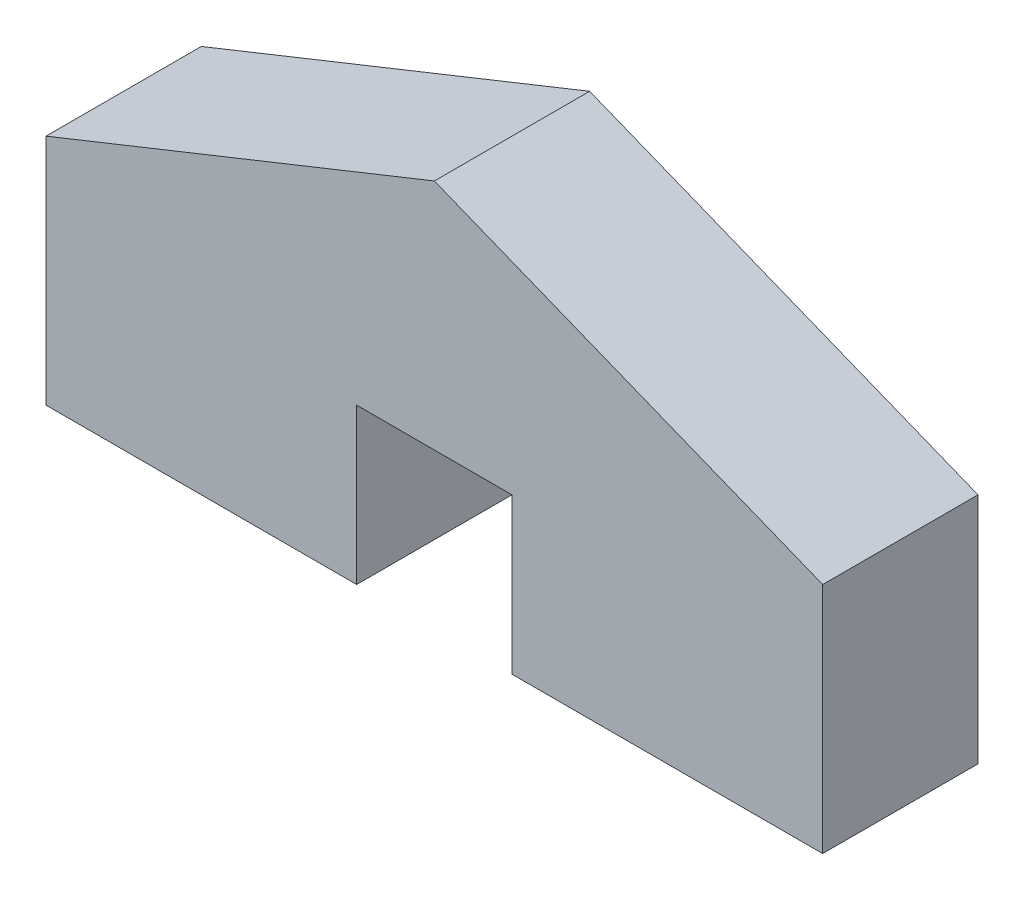
ISO-10303-21;
HEADER;
FILE_DESCRIPTION(('STEP AP214'),'2;1');
FILE_NAME('part.step','',(''),(''),'','','');
FILE_SCHEMA(('AUTOMOTIVE_DESIGN { 1 0 10303 214 1 1 1 1 }'));
ENDSEC;
DATA;
#1=APPLICATION_CONTEXT('core data for automotive mechanical design processes');
#2=APPLICATION_PROTOCOL_DEFINITION('international standard','automotive_design',2000,#1);
#3=PRODUCT_CONTEXT('',#1,'mechanical');
#4=PRODUCT('Part','Part','',(#3));
#5=PRODUCT_RELATED_PRODUCT_CATEGORY('part','',(#4));
#6=PRODUCT_DEFINITION_FORMATION('','',#4);
#7=PRODUCT_DEFINITION_CONTEXT('part definition',#1,'design');
#8=PRODUCT_DEFINITION('design','',#6,#7);
#9=PRODUCT_DEFINITION_SHAPE('','',#8);
#10=(LENGTH_UNIT() NAMED_UNIT(*) SI_UNIT(.MILLI.,.METRE.));
#11=(NAMED_UNIT(*) PLANE_ANGLE_UNIT() SI_UNIT($,.RADIAN.));
#12=(NAMED_UNIT(*) SI_UNIT($,.STERADIAN.) SOLID_ANGLE_UNIT());
#13=UNCERTAINTY_MEASURE_WITH_UNIT(LENGTH_MEASURE(1.E-05),#10,'distance_accuracy_value','');
#14=(GEOMETRIC_REPRESENTATION_CONTEXT(3) GLOBAL_UNCERTAINTY_ASSIGNED_CONTEXT((#13)) GLOBAL_UNIT_ASSIGNED_CONTEXT((#10,
#11,#12)) REPRESENTATION_CONTEXT('',''));
#15=CARTESIAN_POINT('',(0.,0.,0.));
#16=DIRECTION('',(0.,0.,1.));
#17=DIRECTION('',(1.,0.,0.));
#18=AXIS2_PLACEMENT_3D('',#15,#16,#17);
#19=CARTESIAN_POINT('',(50.,0.,20.));
#20=DIRECTION('',(0.,1.,0.));
#21=DIRECTION('',(-1.,0.,0.));
#22=AXIS2_PLACEMENT_3D('',#19,#20,#21);
#23=PLANE('',#22);
#24=DIRECTION('',(1.,0.,0.));
#25=VECTOR('',#24,1.);
#26=CARTESIAN_POINT('',(50.,0.,0.));
#27=LINE('',#26,#25);
#28=CARTESIAN_POINT('',(-50.,0.,0.));
#29=VERTEX_POINT('',#28);
#30=CARTESIAN_POINT('',(-10.,0.,0.));
#31=VERTEX_POINT('',#30);
#32=EDGE_CURVE('E136',#29,#31,#27,.T.);
#33=ORIENTED_EDGE('',*,*,#32,.T.);
#34=DIRECTION('',(0.,0.,1.));
#35=VECTOR('',#34,1.);
#36=CARTESIAN_POINT('',(-10.,0.,0.));
#37=LINE('',#36,#35);
#38=CARTESIAN_POINT('',(-10.,0.,20.));
#39=VERTEX_POINT('',#38);
#40=EDGE_CURVE('E122',#31,#39,#37,.T.);
#41=ORIENTED_EDGE('',*,*,#40,.T.);
#42=DIRECTION('',(1.,0.,0.));
#43=VECTOR('',#42,1.);
#44=CARTESIAN_POINT('',(50.,0.,20.));
#45=LINE('',#44,#43);
#46=CARTESIAN_POINT('',(-50.,0.,20.));
#47=VERTEX_POINT('',#46);
#48=EDGE_CURVE('E105',#47,#39,#45,.T.);
#49=ORIENTED_EDGE('',*,*,#48,.F.);
#50=DIRECTION('',(0.,0.,-1.));
#51=VECTOR('',#50,1.);
#52=CARTESIAN_POINT('',(-50.,0.,20.));
#53=LINE('',#52,#51);
#54=EDGE_CURVE('E111',#47,#29,#53,.T.);
#55=ORIENTED_EDGE('',*,*,#54,.T.);
#56=EDGE_LOOP('',(#33,#41,#49,#55));
#57=FACE_BOUND('',#56,.T.);
#58=ADVANCED_FACE('F35',(#57),#23,.F.);
#59=CARTESIAN_POINT('',(0.,50.,20.));
#60=DIRECTION('',(-0.371390676354104,-0.928476690885259,0.));
#61=DIRECTION('',(0.928476690885259,-0.371390676354104,0.));
#62=AXIS2_PLACEMENT_3D('',#59,#60,#61);
#63=PLANE('',#62);
#64=DIRECTION('',(-0.928476690885259,0.371390676354104,0.));
#65=VECTOR('',#64,1.);
#66=CARTESIAN_POINT('',(0.,50.,0.));
#67=LINE('',#66,#65);
#68=CARTESIAN_POINT('',(50.,30.,0.));
#69=VERTEX_POINT('',#68);
#70=CARTESIAN_POINT('',(0.,50.,0.));
#71=VERTEX_POINT('',#70);
#72=EDGE_CURVE('E128',#69,#71,#67,.T.);
#73=ORIENTED_EDGE('',*,*,#72,.T.);
#74=DIRECTION('',(0.,0.,-1.));
#75=VECTOR('',#74,1.);
#76=CARTESIAN_POINT('',(0.,50.,20.));
#77=LINE('',#76,#75);
#78=CARTESIAN_POINT('',(0.,50.,20.));
#79=VERTEX_POINT('',#78);
#80=EDGE_CURVE('E11',#79,#71,#77,.T.);
#81=ORIENTED_EDGE('',*,*,#80,.F.);
#82=DIRECTION('',(-0.928476690885259,0.371390676354104,0.));
#83=VECTOR('',#82,1.);
#84=CARTESIAN_POINT('',(0.,50.,20.));
#85=LINE('',#84,#83);
#86=CARTESIAN_POINT('',(50.,30.,20.));
#87=VERTEX_POINT('',#86);
#88=EDGE_CURVE('E139',#87,#79,#85,.T.);
#89=ORIENTED_EDGE('',*,*,#88,.F.);
#90=DIRECTION('',(0.,0.,-1.));
#91=VECTOR('',#90,1.);
#92=CARTESIAN_POINT('',(50.,30.,20.));
#93=LINE('',#92,#91);
#94=EDGE_CURVE('E124',#87,#69,#93,.T.);
#95=ORIENTED_EDGE('',*,*,#94,.T.);
#96=EDGE_LOOP('',(#73,#81,#89,#95));
#97=FACE_BOUND('',#96,.T.);
#98=ADVANCED_FACE('F37',(#97),#63,.F.);
#99=CARTESIAN_POINT('',(-50.,30.,20.));
#100=DIRECTION('',(0.371390676354104,-0.928476690885259,0.));
#101=DIRECTION('',(0.928476690885259,0.371390676354104,0.));
#102=AXIS2_PLACEMENT_3D('',#99,#100,#101);
#103=PLANE('',#102);
#104=DIRECTION('',(-0.928476690885259,-0.371390676354104,0.));
#105=VECTOR('',#104,1.);
#106=CARTESIAN_POINT('',(-50.,30.,0.));
#107=LINE('',#106,#105);
#108=CARTESIAN_POINT('',(-50.,30.,0.));
#109=VERTEX_POINT('',#108);
#110=EDGE_CURVE('E131',#71,#109,#107,.T.);
#111=ORIENTED_EDGE('',*,*,#110,.T.);
#112=DIRECTION('',(0.,0.,-1.));
#113=VECTOR('',#112,1.);
#114=CARTESIAN_POINT('',(-50.,30.,20.));
#115=LINE('',#114,#113);
#116=CARTESIAN_POINT('',(-50.,30.,20.));
#117=VERTEX_POINT('',#116);
#118=EDGE_CURVE('E43',#117,#109,#115,.T.);
#119=ORIENTED_EDGE('',*,*,#118,.F.);
#120=DIRECTION('',(-0.928476690885259,-0.371390676354104,0.));
#121=VECTOR('',#120,1.);
#122=CARTESIAN_POINT('',(-50.,30.,20.));
#123=LINE('',#122,#121);
#124=EDGE_CURVE('E91',#79,#117,#123,.T.);
#125=ORIENTED_EDGE('',*,*,#124,.F.);
#126=ORIENTED_EDGE('',*,*,#80,.T.);
#127=EDGE_LOOP('',(#111,#119,#125,#126));
#128=FACE_BOUND('',#127,.T.);
#129=ADVANCED_FACE('F189',(#128),#103,.F.);
#130=CARTESIAN_POINT('',(-50.,0.,20.));
#131=DIRECTION('',(1.,0.,0.));
#132=DIRECTION('',(0.,0.,-1.));
#133=AXIS2_PLACEMENT_3D('',#130,#131,#132);
#134=PLANE('',#133);
#135=DIRECTION('',(0.,-1.,0.));
#136=VECTOR('',#135,1.);
#137=CARTESIAN_POINT('',(-50.,0.,0.));
#138=LINE('',#137,#136);
#139=EDGE_CURVE('E114',#109,#29,#138,.T.);
#140=ORIENTED_EDGE('',*,*,#139,.T.);
#141=ORIENTED_EDGE('',*,*,#54,.F.);
#142=DIRECTION('',(0.,-1.,0.));
#143=VECTOR('',#142,1.);
#144=CARTESIAN_POINT('',(-50.,0.,20.));
#145=LINE('',#144,#143);
#146=EDGE_CURVE('E99',#117,#47,#145,.T.);
#147=ORIENTED_EDGE('',*,*,#146,.F.);
#148=ORIENTED_EDGE('',*,*,#118,.T.);
#149=EDGE_LOOP('',(#140,#141,#147,#148));
#150=FACE_BOUND('',#149,.T.);
#151=ADVANCED_FACE('F112',(#150),#134,.F.);
#152=CARTESIAN_POINT('',(10.,0.,20.));
#153=VERTEX_POINT('',#152);
#154=CARTESIAN_POINT('',(50.,0.,20.));
#155=VERTEX_POINT('',#154);
#156=EDGE_CURVE('E108',#153,#155,#45,.T.);
#157=ORIENTED_EDGE('',*,*,#156,.F.);
#158=DIRECTION('',(0.,0.,1.));
#159=VECTOR('',#158,1.);
#160=CARTESIAN_POINT('',(10.,0.,0.));
#161=LINE('',#160,#159);
#162=CARTESIAN_POINT('',(10.,0.,0.));
#163=VERTEX_POINT('',#162);
#164=EDGE_CURVE('E169',#163,#153,#161,.T.);
#165=ORIENTED_EDGE('',*,*,#164,.F.);
#166=CARTESIAN_POINT('',(50.,0.,0.));
#167=VERTEX_POINT('',#166);
#168=EDGE_CURVE('E135',#163,#167,#27,.T.);
#169=ORIENTED_EDGE('',*,*,#168,.T.);
#170=DIRECTION('',(0.,0.,-1.));
#171=VECTOR('',#170,1.);
#172=CARTESIAN_POINT('',(50.,0.,20.));
#173=LINE('',#172,#171);
#174=EDGE_CURVE('E118',#155,#167,#173,.T.);
#175=ORIENTED_EDGE('',*,*,#174,.F.);
#176=EDGE_LOOP('',(#157,#165,#169,#175));
#177=FACE_BOUND('',#176,.T.);
#178=ADVANCED_FACE('F195',(#177),#23,.F.);
#179=CARTESIAN_POINT('',(50.,0.,20.));
#180=DIRECTION('',(-1.,0.,0.));
#181=DIRECTION('',(0.,-1.,0.));
#182=AXIS2_PLACEMENT_3D('',#179,#180,#181);
#183=PLANE('',#182);
#184=DIRECTION('',(0.,1.,0.));
#185=VECTOR('',#184,1.);
#186=CARTESIAN_POINT('',(50.,0.,0.));
#187=LINE('',#186,#185);
#188=EDGE_CURVE('E83',#167,#69,#187,.T.);
#189=ORIENTED_EDGE('',*,*,#188,.T.);
#190=ORIENTED_EDGE('',*,*,#94,.F.);
#191=DIRECTION('',(0.,1.,0.));
#192=VECTOR('',#191,1.);
#193=CARTESIAN_POINT('',(50.,0.,20.));
#194=LINE('',#193,#192);
#195=EDGE_CURVE('E59',#155,#87,#194,.T.);
#196=ORIENTED_EDGE('',*,*,#195,.F.);
#197=ORIENTED_EDGE('',*,*,#174,.T.);
#198=EDGE_LOOP('',(#189,#190,#196,#197));
#199=FACE_BOUND('',#198,.T.);
#200=ADVANCED_FACE('F203',(#199),#183,.F.);
#201=CARTESIAN_POINT('',(0.,0.,20.));
#202=DIRECTION('',(0.,0.,1.));
#203=DIRECTION('',(1.,0.,0.));
#204=AXIS2_PLACEMENT_3D('',#201,#202,#203);
#205=PLANE('',#204);
#206=DIRECTION('',(0.,-1.,0.));
#207=VECTOR('',#206,1.);
#208=CARTESIAN_POINT('',(-10.,0.,20.));
#209=LINE('',#208,#207);
#210=CARTESIAN_POINT('',(-10.,20.,20.));
#211=VERTEX_POINT('',#210);
#212=EDGE_CURVE('E176',#211,#39,#209,.T.);
#213=ORIENTED_EDGE('',*,*,#212,.F.);
#214=DIRECTION('',(-1.,0.,0.));
#215=VECTOR('',#214,1.);
#216=CARTESIAN_POINT('',(-10.,20.,20.));
#217=LINE('',#216,#215);
#218=CARTESIAN_POINT('',(10.,20.,20.));
#219=VERTEX_POINT('',#218);
#220=EDGE_CURVE('E166',#219,#211,#217,.T.);
#221=ORIENTED_EDGE('',*,*,#220,.F.);
#222=DIRECTION('',(0.,1.,0.));
#223=VECTOR('',#222,1.);
#224=CARTESIAN_POINT('',(10.,0.,20.));
#225=LINE('',#224,#223);
#226=EDGE_CURVE('E172',#153,#219,#225,.T.);
#227=ORIENTED_EDGE('',*,*,#226,.F.);
#228=ORIENTED_EDGE('',*,*,#156,.T.);
#229=ORIENTED_EDGE('',*,*,#195,.T.);
#230=ORIENTED_EDGE('',*,*,#88,.T.);
#231=ORIENTED_EDGE('',*,*,#124,.T.);
#232=ORIENTED_EDGE('',*,*,#146,.T.);
#233=ORIENTED_EDGE('',*,*,#48,.T.);
#234=EDGE_LOOP('',(#213,#221,#227,#228,#229,#230,#231,#232,#233));
#235=FACE_BOUND('',#234,.T.);
#236=ADVANCED_FACE('F102',(#235),#205,.T.);
#237=CARTESIAN_POINT('',(0.,0.,0.));
#238=DIRECTION('',(0.,0.,1.));
#239=DIRECTION('',(1.,0.,0.));
#240=AXIS2_PLACEMENT_3D('',#237,#238,#239);
#241=PLANE('',#240);
#242=DIRECTION('',(-1.,0.,0.));
#243=VECTOR('',#242,1.);
#244=CARTESIAN_POINT('',(-10.,20.,0.));
#245=LINE('',#244,#243);
#246=CARTESIAN_POINT('',(10.,20.,0.));
#247=VERTEX_POINT('',#246);
#248=CARTESIAN_POINT('',(-10.,20.,0.));
#249=VERTEX_POINT('',#248);
#250=EDGE_CURVE('E50',#247,#249,#245,.T.);
#251=ORIENTED_EDGE('',*,*,#250,.T.);
#252=DIRECTION('',(0.,-1.,0.));
#253=VECTOR('',#252,1.);
#254=CARTESIAN_POINT('',(-10.,0.,0.));
#255=LINE('',#254,#253);
#256=EDGE_CURVE('E147',#249,#31,#255,.T.);
#257=ORIENTED_EDGE('',*,*,#256,.T.);
#258=ORIENTED_EDGE('',*,*,#32,.F.);
#259=ORIENTED_EDGE('',*,*,#139,.F.);
#260=ORIENTED_EDGE('',*,*,#110,.F.);
#261=ORIENTED_EDGE('',*,*,#72,.F.);
#262=ORIENTED_EDGE('',*,*,#188,.F.);
#263=ORIENTED_EDGE('',*,*,#168,.F.);
#264=DIRECTION('',(0.,1.,0.));
#265=VECTOR('',#264,1.);
#266=CARTESIAN_POINT('',(10.,0.,0.));
#267=LINE('',#266,#265);
#268=EDGE_CURVE('E179',#163,#247,#267,.T.);
#269=ORIENTED_EDGE('',*,*,#268,.T.);
#270=EDGE_LOOP('',(#251,#257,#258,#259,#260,#261,#262,#263,#269));
#271=FACE_BOUND('',#270,.T.);
#272=ADVANCED_FACE('F142',(#271),#241,.F.);
#273=CARTESIAN_POINT('',(-10.,0.,0.));
#274=DIRECTION('',(-1.,0.,0.));
#275=DIRECTION('',(0.,0.,1.));
#276=AXIS2_PLACEMENT_3D('',#273,#274,#275);
#277=PLANE('',#276);
#278=ORIENTED_EDGE('',*,*,#212,.T.);
#279=ORIENTED_EDGE('',*,*,#40,.F.);
#280=ORIENTED_EDGE('',*,*,#256,.F.);
#281=DIRECTION('',(0.,0.,1.));
#282=VECTOR('',#281,1.);
#283=CARTESIAN_POINT('',(-10.,20.,0.));
#284=LINE('',#283,#282);
#285=EDGE_CURVE('E132',#249,#211,#284,.T.);
#286=ORIENTED_EDGE('',*,*,#285,.T.);
#287=EDGE_LOOP('',(#278,#279,#280,#286));
#288=FACE_BOUND('',#287,.T.);
#289=ADVANCED_FACE('F212',(#288),#277,.F.);
#290=CARTESIAN_POINT('',(-10.,20.,0.));
#291=DIRECTION('',(0.,1.,0.));
#292=DIRECTION('',(0.,0.,1.));
#293=AXIS2_PLACEMENT_3D('',#290,#291,#292);
#294=PLANE('',#293);
#295=ORIENTED_EDGE('',*,*,#220,.T.);
#296=ORIENTED_EDGE('',*,*,#285,.F.);
#297=ORIENTED_EDGE('',*,*,#250,.F.);
#298=DIRECTION('',(0.,0.,1.));
#299=VECTOR('',#298,1.);
#300=CARTESIAN_POINT('',(10.,20.,0.));
#301=LINE('',#300,#299);
#302=EDGE_CURVE('E162',#247,#219,#301,.T.);
#303=ORIENTED_EDGE('',*,*,#302,.T.);
#304=EDGE_LOOP('',(#295,#296,#297,#303));
#305=FACE_BOUND('',#304,.T.);
#306=ADVANCED_FACE('F164',(#305),#294,.F.);
#307=CARTESIAN_POINT('',(10.,0.,0.));
#308=DIRECTION('',(1.,0.,0.));
#309=DIRECTION('',(0.,0.,-1.));
#310=AXIS2_PLACEMENT_3D('',#307,#308,#309);
#311=PLANE('',#310);
#312=ORIENTED_EDGE('',*,*,#226,.T.);
#313=ORIENTED_EDGE('',*,*,#302,.F.);
#314=ORIENTED_EDGE('',*,*,#268,.F.);
#315=ORIENTED_EDGE('',*,*,#164,.T.);
#316=EDGE_LOOP('',(#312,#313,#314,#315));
#317=FACE_BOUND('',#316,.T.);
#318=ADVANCED_FACE('F173',(#317),#311,.F.);
#319=CLOSED_SHELL('',(#58,#98,#129,#151,#178,#200,#236,#272,#289,#306,#318));
#320=MANIFOLD_SOLID_BREP('B2',#319);
#321=ADVANCED_BREP_SHAPE_REPRESENTATION('',(#18,#320),#14);
#322=SHAPE_DEFINITION_REPRESENTATION(#9,#321);
ENDSEC;
END-ISO-10303-21;
